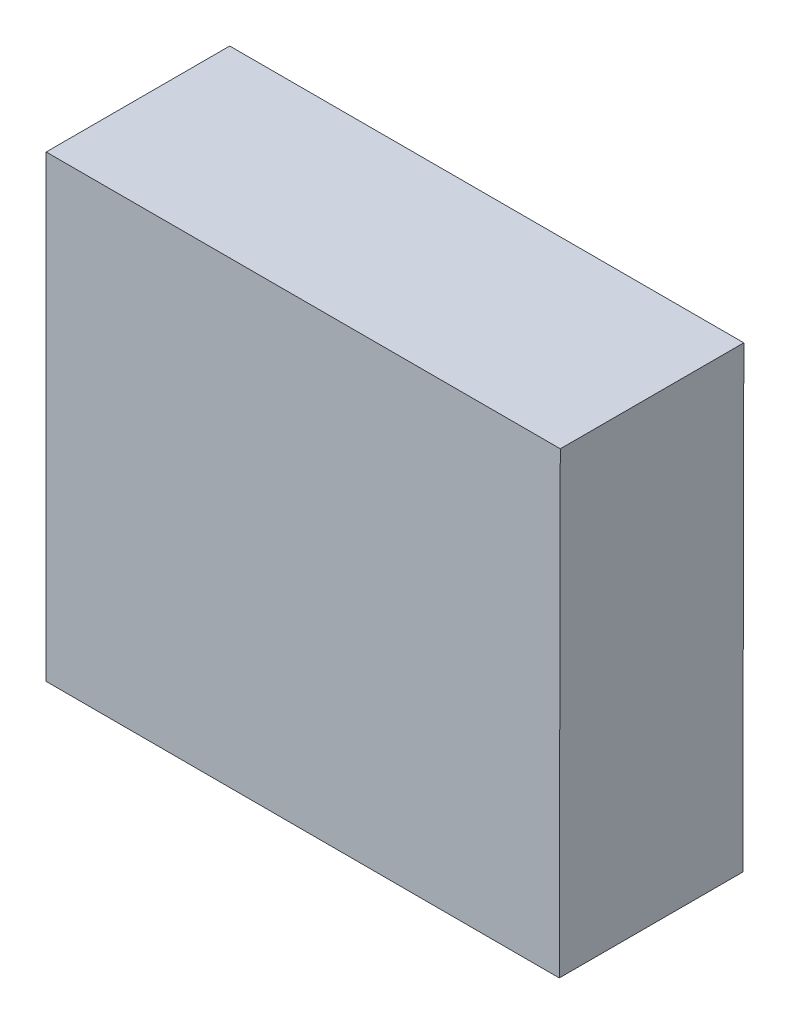
ISO-10303-21;
HEADER;
FILE_DESCRIPTION(('STEP AP214'),'2;1');
FILE_NAME('part.step','',(''),(''),'','','');
FILE_SCHEMA(('AUTOMOTIVE_DESIGN { 1 0 10303 214 1 1 1 1 }'));
ENDSEC;
DATA;
#1=APPLICATION_CONTEXT('core data for automotive mechanical design processes');
#2=APPLICATION_PROTOCOL_DEFINITION('international standard','automotive_design',2000,#1);
#3=PRODUCT_CONTEXT('',#1,'mechanical');
#4=PRODUCT('Part','Part','',(#3));
#5=PRODUCT_RELATED_PRODUCT_CATEGORY('part','',(#4));
#6=PRODUCT_DEFINITION_FORMATION('','',#4);
#7=PRODUCT_DEFINITION_CONTEXT('part definition',#1,'design');
#8=PRODUCT_DEFINITION('design','',#6,#7);
#9=PRODUCT_DEFINITION_SHAPE('','',#8);
#10=(LENGTH_UNIT() NAMED_UNIT(*) SI_UNIT(.MILLI.,.METRE.));
#11=(NAMED_UNIT(*) PLANE_ANGLE_UNIT() SI_UNIT($,.RADIAN.));
#12=(NAMED_UNIT(*) SI_UNIT($,.STERADIAN.) SOLID_ANGLE_UNIT());
#13=UNCERTAINTY_MEASURE_WITH_UNIT(LENGTH_MEASURE(1.E-05),#10,'distance_accuracy_value','');
#14=(GEOMETRIC_REPRESENTATION_CONTEXT(3) GLOBAL_UNCERTAINTY_ASSIGNED_CONTEXT((#13)) GLOBAL_UNIT_ASSIGNED_CONTEXT((#10,
#11,#12)) REPRESENTATION_CONTEXT('',''));
#15=CARTESIAN_POINT('',(0.,0.,0.));
#16=DIRECTION('',(0.,0.,1.));
#17=DIRECTION('',(1.,0.,0.));
#18=AXIS2_PLACEMENT_3D('',#15,#16,#17);
#19=CARTESIAN_POINT('',(-0.70022974,0.62491366,0.50000154));
#20=DIRECTION('',(0.,0.,-1.));
#21=DIRECTION('',(-1.,0.,0.));
#22=AXIS2_PLACEMENT_3D('',#19,#20,#21);
#23=PLANE('',#22);
#24=DIRECTION('',(-0.999999858252953,0.000532441614894975,0.));
#25=VECTOR('',#24,1.);
#26=CARTESIAN_POINT('',(-0.70022974,-0.6241669,0.50000154));
#27=LINE('',#26,#25);
#28=CARTESIAN_POINT('',(-0.70022974,-0.6241669,0.50000154));
#29=VERTEX_POINT('',#28);
#30=CARTESIAN_POINT('',(0.69751956,-0.62491112,0.50000154));
#31=VERTEX_POINT('',#30);
#32=EDGE_CURVE('E55',#29,#31,#27,.F.);
#33=ORIENTED_EDGE('',*,*,#32,.T.);
#34=DIRECTION('',(-0.00216844286617901,-0.999997648925004,0.));
#35=VECTOR('',#34,1.);
#36=CARTESIAN_POINT('',(0.69751956,-0.62491112,0.50000154));
#37=LINE('',#36,#35);
#38=CARTESIAN_POINT('',(0.70022974,0.62491366,0.50000154));
#39=VERTEX_POINT('',#38);
#40=EDGE_CURVE('E57',#31,#39,#37,.F.);
#41=ORIENTED_EDGE('',*,*,#40,.T.);
#42=DIRECTION('',(1.,0.,0.));
#43=VECTOR('',#42,1.);
#44=CARTESIAN_POINT('',(0.70022974,0.62491366,0.50000154));
#45=LINE('',#44,#43);
#46=CARTESIAN_POINT('',(-0.70022974,0.62491366,0.50000154));
#47=VERTEX_POINT('',#46);
#48=EDGE_CURVE('E20',#39,#47,#45,.F.);
#49=ORIENTED_EDGE('',*,*,#48,.T.);
#50=DIRECTION('',(0.,1.,0.));
#51=VECTOR('',#50,1.);
#52=CARTESIAN_POINT('',(-0.70022974,0.62491366,0.50000154));
#53=LINE('',#52,#51);
#54=EDGE_CURVE('E80',#47,#29,#53,.F.);
#55=ORIENTED_EDGE('',*,*,#54,.T.);
#56=EDGE_LOOP('',(#33,#41,#49,#55));
#57=FACE_BOUND('',#56,.T.);
#58=ADVANCED_FACE('F17',(#57),#23,.F.);
#59=CARTESIAN_POINT('',(0.70022974,0.62491366,0.));
#60=DIRECTION('',(0.,-1.,0.));
#61=DIRECTION('',(0.,0.,-1.));
#62=AXIS2_PLACEMENT_3D('',#59,#60,#61);
#63=PLANE('',#62);
#64=DIRECTION('',(0.,0.,-1.));
#65=VECTOR('',#64,1.);
#66=CARTESIAN_POINT('',(-0.70022974,0.62491366,0.));
#67=LINE('',#66,#65);
#68=CARTESIAN_POINT('',(-0.70022974,0.62491366,0.));
#69=VERTEX_POINT('',#68);
#70=EDGE_CURVE('E68',#69,#47,#67,.F.);
#71=ORIENTED_EDGE('',*,*,#70,.T.);
#72=ORIENTED_EDGE('',*,*,#48,.F.);
#73=DIRECTION('',(0.,0.,1.));
#74=VECTOR('',#73,1.);
#75=CARTESIAN_POINT('',(0.700229740000001,0.62491366,0.));
#76=LINE('',#75,#74);
#77=CARTESIAN_POINT('',(0.70022974,0.62491366,0.));
#78=VERTEX_POINT('',#77);
#79=EDGE_CURVE('E63',#39,#78,#76,.F.);
#80=ORIENTED_EDGE('',*,*,#79,.T.);
#81=DIRECTION('',(-1.,0.,0.));
#82=VECTOR('',#81,1.);
#83=CARTESIAN_POINT('',(-0.70022974,0.62491366,0.));
#84=LINE('',#83,#82);
#85=EDGE_CURVE('E83',#69,#78,#84,.F.);
#86=ORIENTED_EDGE('',*,*,#85,.F.);
#87=EDGE_LOOP('',(#71,#72,#80,#86));
#88=FACE_BOUND('',#87,.T.);
#89=ADVANCED_FACE('F65',(#88),#63,.F.);
#90=CARTESIAN_POINT('',(0.69751956,-0.62491112,0.));
#91=DIRECTION('',(-0.999997648925004,0.00216844286617901,0.));
#92=DIRECTION('',(-0.00216844286617901,-0.999997648925004,0.));
#93=AXIS2_PLACEMENT_3D('',#90,#91,#92);
#94=PLANE('',#93);
#95=ORIENTED_EDGE('',*,*,#79,.F.);
#96=ORIENTED_EDGE('',*,*,#40,.F.);
#97=DIRECTION('',(0.,0.,1.));
#98=VECTOR('',#97,1.);
#99=CARTESIAN_POINT('',(0.69751956,-0.624911120000001,0.));
#100=LINE('',#99,#98);
#101=CARTESIAN_POINT('',(0.69751956,-0.62491112,0.));
#102=VERTEX_POINT('',#101);
#103=EDGE_CURVE('E75',#31,#102,#100,.F.);
#104=ORIENTED_EDGE('',*,*,#103,.T.);
#105=DIRECTION('',(-0.00216844286617814,-0.999997648925004,0.));
#106=VECTOR('',#105,1.);
#107=CARTESIAN_POINT('',(0.70022974,0.62491366,0.));
#108=LINE('',#107,#106);
#109=EDGE_CURVE('E72',#78,#102,#108,.T.);
#110=ORIENTED_EDGE('',*,*,#109,.F.);
#111=EDGE_LOOP('',(#95,#96,#104,#110));
#112=FACE_BOUND('',#111,.T.);
#113=ADVANCED_FACE('F70',(#112),#94,.F.);
#114=CARTESIAN_POINT('',(-0.70022974,-0.6241669,0.));
#115=DIRECTION('',(0.000532441614894975,0.999999858252953,0.));
#116=DIRECTION('',(-0.999999858252953,0.000532441614894975,0.));
#117=AXIS2_PLACEMENT_3D('',#114,#115,#116);
#118=PLANE('',#117);
#119=ORIENTED_EDGE('',*,*,#103,.F.);
#120=ORIENTED_EDGE('',*,*,#32,.F.);
#121=DIRECTION('',(0.,0.,-1.));
#122=VECTOR('',#121,1.);
#123=CARTESIAN_POINT('',(-0.70022974,-0.6241669,0.));
#124=LINE('',#123,#122);
#125=CARTESIAN_POINT('',(-0.70022974,-0.6241669,0.));
#126=VERTEX_POINT('',#125);
#127=EDGE_CURVE('E35',#29,#126,#124,.T.);
#128=ORIENTED_EDGE('',*,*,#127,.T.);
#129=DIRECTION('',(-0.999999858252953,0.000532441614894034,0.));
#130=VECTOR('',#129,1.);
#131=CARTESIAN_POINT('',(0.69751956,-0.62491112,0.));
#132=LINE('',#131,#130);
#133=EDGE_CURVE('E26',#102,#126,#132,.T.);
#134=ORIENTED_EDGE('',*,*,#133,.F.);
#135=EDGE_LOOP('',(#119,#120,#128,#134));
#136=FACE_BOUND('',#135,.T.);
#137=ADVANCED_FACE('F89',(#136),#118,.F.);
#138=CARTESIAN_POINT('',(-0.70022974,0.62491366,0.));
#139=DIRECTION('',(1.,0.,0.));
#140=DIRECTION('',(0.,0.,-1.));
#141=AXIS2_PLACEMENT_3D('',#138,#139,#140);
#142=PLANE('',#141);
#143=ORIENTED_EDGE('',*,*,#127,.F.);
#144=ORIENTED_EDGE('',*,*,#54,.F.);
#145=ORIENTED_EDGE('',*,*,#70,.F.);
#146=DIRECTION('',(0.,1.,0.));
#147=VECTOR('',#146,1.);
#148=CARTESIAN_POINT('',(-0.70022974,0.62491366,0.));
#149=LINE('',#148,#147);
#150=EDGE_CURVE('E11',#126,#69,#149,.T.);
#151=ORIENTED_EDGE('',*,*,#150,.F.);
#152=EDGE_LOOP('',(#143,#144,#145,#151));
#153=FACE_BOUND('',#152,.T.);
#154=ADVANCED_FACE('F91',(#153),#142,.F.);
#155=CARTESIAN_POINT('',(-0.70022974,0.62491366,0.));
#156=DIRECTION('',(0.,0.,-1.));
#157=DIRECTION('',(-1.,0.,0.));
#158=AXIS2_PLACEMENT_3D('',#155,#156,#157);
#159=PLANE('',#158);
#160=ORIENTED_EDGE('',*,*,#133,.T.);
#161=ORIENTED_EDGE('',*,*,#150,.T.);
#162=ORIENTED_EDGE('',*,*,#85,.T.);
#163=ORIENTED_EDGE('',*,*,#109,.T.);
#164=EDGE_LOOP('',(#160,#161,#162,#163));
#165=FACE_BOUND('',#164,.T.);
#166=ADVANCED_FACE('F88',(#165),#159,.T.);
#167=CLOSED_SHELL('',(#58,#89,#113,#137,#154,#166));
#168=MANIFOLD_SOLID_BREP('B1',#167);
#169=ADVANCED_BREP_SHAPE_REPRESENTATION('',(#18,#168),#14);
#170=SHAPE_DEFINITION_REPRESENTATION(#9,#169);
ENDSEC;
END-ISO-10303-21;
